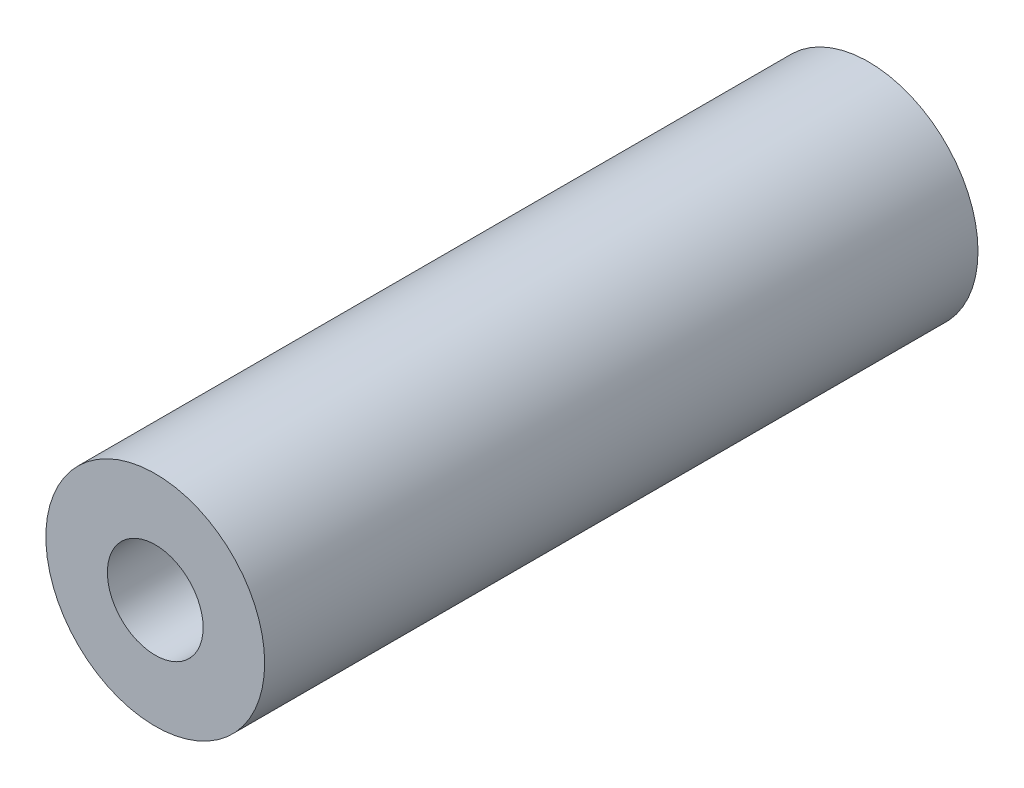
ISO-10303-21;
HEADER;
FILE_DESCRIPTION(('STEP AP214'),'2;1');
FILE_NAME('part.step','',(''),(''),'','','');
FILE_SCHEMA(('AUTOMOTIVE_DESIGN { 1 0 10303 214 1 1 1 1 }'));
ENDSEC;
DATA;
#1=APPLICATION_CONTEXT('core data for automotive mechanical design processes');
#2=APPLICATION_PROTOCOL_DEFINITION('international standard','automotive_design',2000,#1);
#3=PRODUCT_CONTEXT('',#1,'mechanical');
#4=PRODUCT('Part','Part','',(#3));
#5=PRODUCT_RELATED_PRODUCT_CATEGORY('part','',(#4));
#6=PRODUCT_DEFINITION_FORMATION('','',#4);
#7=PRODUCT_DEFINITION_CONTEXT('part definition',#1,'design');
#8=PRODUCT_DEFINITION('design','',#6,#7);
#9=PRODUCT_DEFINITION_SHAPE('','',#8);
#10=(LENGTH_UNIT() NAMED_UNIT(*) SI_UNIT(.MILLI.,.METRE.));
#11=(NAMED_UNIT(*) PLANE_ANGLE_UNIT() SI_UNIT($,.RADIAN.));
#12=(NAMED_UNIT(*) SI_UNIT($,.STERADIAN.) SOLID_ANGLE_UNIT());
#13=UNCERTAINTY_MEASURE_WITH_UNIT(LENGTH_MEASURE(1.E-05),#10,'distance_accuracy_value','');
#14=(GEOMETRIC_REPRESENTATION_CONTEXT(3) GLOBAL_UNCERTAINTY_ASSIGNED_CONTEXT((#13)) GLOBAL_UNIT_ASSIGNED_CONTEXT((#10,
#11,#12)) REPRESENTATION_CONTEXT('',''));
#15=CARTESIAN_POINT('',(0.,0.,0.));
#16=DIRECTION('',(0.,0.,1.));
#17=DIRECTION('',(1.,0.,0.));
#18=AXIS2_PLACEMENT_3D('',#15,#16,#17);
#19=CARTESIAN_POINT('',(0.,0.,0.));
#20=DIRECTION('',(0.,0.,1.));
#21=DIRECTION('',(1.,0.,0.));
#22=AXIS2_PLACEMENT_3D('',#19,#20,#21);
#23=CYLINDRICAL_SURFACE('',#22,2.778125);
#24=CARTESIAN_POINT('',(0.,0.,0.));
#25=DIRECTION('',(0.,0.,1.));
#26=DIRECTION('',(1.,0.,0.));
#27=AXIS2_PLACEMENT_3D('',#24,#25,#26);
#28=CIRCLE('',#27,2.778125);
#29=CARTESIAN_POINT('',(2.778125,0.,0.));
#30=VERTEX_POINT('',#29);
#31=EDGE_CURVE('E27',#30,#30,#28,.T.);
#32=ORIENTED_EDGE('',*,*,#31,.F.);
#33=EDGE_LOOP('',(#32));
#34=FACE_BOUND('',#33,.T.);
#35=CARTESIAN_POINT('',(0.,0.,41.402));
#36=DIRECTION('',(0.,0.,1.));
#37=DIRECTION('',(1.,0.,0.));
#38=AXIS2_PLACEMENT_3D('',#35,#36,#37);
#39=CIRCLE('',#38,2.778125);
#40=CARTESIAN_POINT('',(2.778125,0.,41.402));
#41=VERTEX_POINT('',#40);
#42=EDGE_CURVE('E18',#41,#41,#39,.T.);
#43=ORIENTED_EDGE('',*,*,#42,.T.);
#44=EDGE_LOOP('',(#43));
#45=FACE_BOUND('',#44,.T.);
#46=ADVANCED_FACE('F15',(#34,#45),#23,.F.);
#47=CARTESIAN_POINT('',(0.,0.,41.402));
#48=DIRECTION('',(0.,0.,-1.));
#49=DIRECTION('',(-1.,0.,0.));
#50=AXIS2_PLACEMENT_3D('',#47,#48,#49);
#51=PLANE('',#50);
#52=ORIENTED_EDGE('',*,*,#42,.F.);
#53=EDGE_LOOP('',(#52));
#54=FACE_BOUND('',#53,.T.);
#55=CARTESIAN_POINT('',(0.,0.,41.402));
#56=DIRECTION('',(0.,0.,1.));
#57=DIRECTION('',(1.,0.,0.));
#58=AXIS2_PLACEMENT_3D('',#55,#56,#57);
#59=CIRCLE('',#58,6.35);
#60=CARTESIAN_POINT('',(6.35,0.,41.402));
#61=VERTEX_POINT('',#60);
#62=EDGE_CURVE('E22',#61,#61,#59,.F.);
#63=ORIENTED_EDGE('',*,*,#62,.F.);
#64=EDGE_LOOP('',(#63));
#65=FACE_BOUND('',#64,.T.);
#66=ADVANCED_FACE('F36',(#54,#65),#51,.F.);
#67=CARTESIAN_POINT('',(0.,0.,0.));
#68=DIRECTION('',(0.,0.,-1.));
#69=DIRECTION('',(-1.,0.,0.));
#70=AXIS2_PLACEMENT_3D('',#67,#68,#69);
#71=PLANE('',#70);
#72=ORIENTED_EDGE('',*,*,#31,.T.);
#73=EDGE_LOOP('',(#72));
#74=FACE_BOUND('',#73,.T.);
#75=CARTESIAN_POINT('',(0.,0.,0.));
#76=DIRECTION('',(0.,0.,1.));
#77=DIRECTION('',(1.,0.,0.));
#78=AXIS2_PLACEMENT_3D('',#75,#76,#77);
#79=CIRCLE('',#78,6.35);
#80=CARTESIAN_POINT('',(6.35,0.,0.));
#81=VERTEX_POINT('',#80);
#82=EDGE_CURVE('E10',#81,#81,#79,.T.);
#83=ORIENTED_EDGE('',*,*,#82,.F.);
#84=EDGE_LOOP('',(#83));
#85=FACE_BOUND('',#84,.T.);
#86=ADVANCED_FACE('F39',(#74,#85),#71,.T.);
#87=CARTESIAN_POINT('',(0.,0.,0.));
#88=DIRECTION('',(0.,0.,1.));
#89=DIRECTION('',(1.,0.,0.));
#90=AXIS2_PLACEMENT_3D('',#87,#88,#89);
#91=CYLINDRICAL_SURFACE('',#90,6.35);
#92=ORIENTED_EDGE('',*,*,#82,.T.);
#93=EDGE_LOOP('',(#92));
#94=FACE_BOUND('',#93,.T.);
#95=ORIENTED_EDGE('',*,*,#62,.T.);
#96=EDGE_LOOP('',(#95));
#97=FACE_BOUND('',#96,.T.);
#98=ADVANCED_FACE('F42',(#94,#97),#91,.T.);
#99=CLOSED_SHELL('',(#46,#66,#86,#98));
#100=MANIFOLD_SOLID_BREP('B1',#99);
#101=ADVANCED_BREP_SHAPE_REPRESENTATION('',(#18,#100),#14);
#102=SHAPE_DEFINITION_REPRESENTATION(#9,#101);
ENDSEC;
END-ISO-10303-21;
